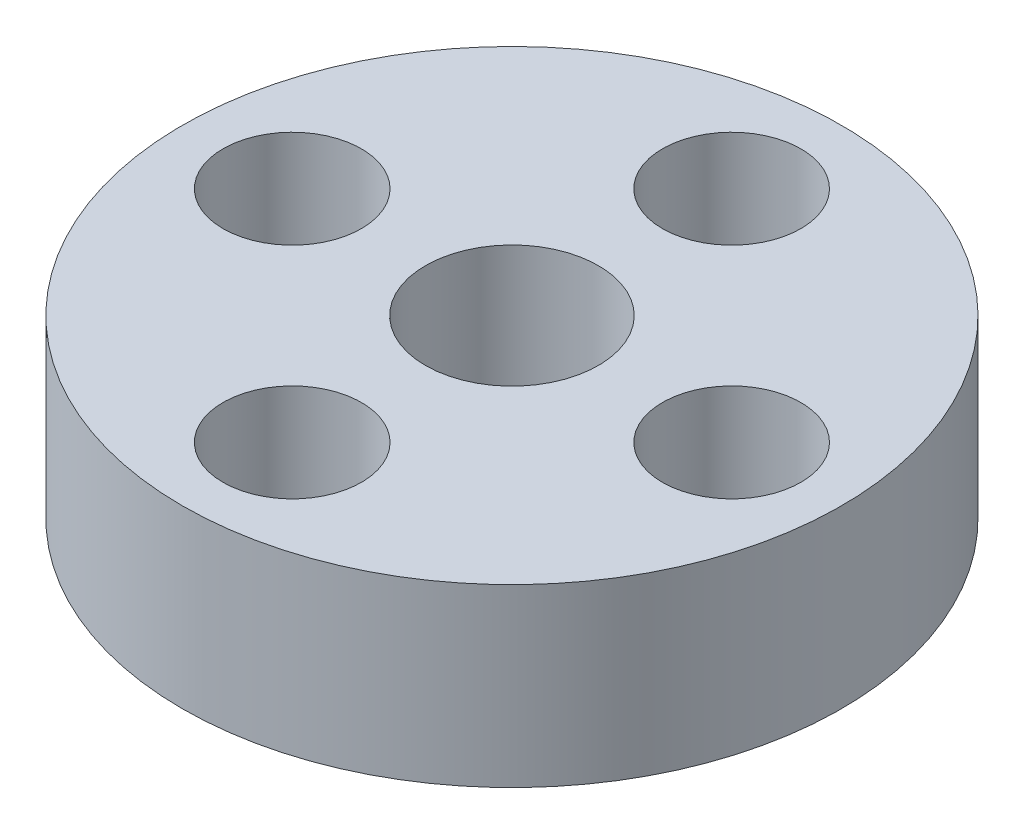
ISO-10303-21;
HEADER;
FILE_DESCRIPTION(('STEP AP214'),'2;1');
FILE_NAME('part.step','',(''),(''),'','','');
FILE_SCHEMA(('AUTOMOTIVE_DESIGN { 1 0 10303 214 1 1 1 1 }'));
ENDSEC;
DATA;
#1=APPLICATION_CONTEXT('core data for automotive mechanical design processes');
#2=APPLICATION_PROTOCOL_DEFINITION('international standard','automotive_design',2000,#1);
#3=PRODUCT_CONTEXT('',#1,'mechanical');
#4=PRODUCT('Part','Part','',(#3));
#5=PRODUCT_RELATED_PRODUCT_CATEGORY('part','',(#4));
#6=PRODUCT_DEFINITION_FORMATION('','',#4);
#7=PRODUCT_DEFINITION_CONTEXT('part definition',#1,'design');
#8=PRODUCT_DEFINITION('design','',#6,#7);
#9=PRODUCT_DEFINITION_SHAPE('','',#8);
#10=(LENGTH_UNIT() NAMED_UNIT(*) SI_UNIT(.MILLI.,.METRE.));
#11=(NAMED_UNIT(*) PLANE_ANGLE_UNIT() SI_UNIT($,.RADIAN.));
#12=(NAMED_UNIT(*) SI_UNIT($,.STERADIAN.) SOLID_ANGLE_UNIT());
#13=UNCERTAINTY_MEASURE_WITH_UNIT(LENGTH_MEASURE(1.E-05),#10,'distance_accuracy_value','');
#14=(GEOMETRIC_REPRESENTATION_CONTEXT(3) GLOBAL_UNCERTAINTY_ASSIGNED_CONTEXT((#13)) GLOBAL_UNIT_ASSIGNED_CONTEXT((#10,
#11,#12)) REPRESENTATION_CONTEXT('',''));
#15=CARTESIAN_POINT('',(0.,0.,0.));
#16=DIRECTION('',(0.,0.,1.));
#17=DIRECTION('',(1.,0.,0.));
#18=AXIS2_PLACEMENT_3D('',#15,#16,#17);
#19=CARTESIAN_POINT('',(0.,5.08,0.));
#20=DIRECTION('',(0.,-1.,0.));
#21=DIRECTION('',(0.,0.,-1.));
#22=AXIS2_PLACEMENT_3D('',#19,#20,#21);
#23=CYLINDRICAL_SURFACE('',#22,9.525);
#24=CARTESIAN_POINT('',(0.,5.08,0.));
#25=DIRECTION('',(0.,1.,0.));
#26=DIRECTION('',(0.,0.,1.));
#27=AXIS2_PLACEMENT_3D('',#24,#25,#26);
#28=CIRCLE('',#27,9.525);
#29=CARTESIAN_POINT('',(0.,5.08,9.525));
#30=VERTEX_POINT('',#29);
#31=EDGE_CURVE('E10',#30,#30,#28,.T.);
#32=ORIENTED_EDGE('',*,*,#31,.F.);
#33=EDGE_LOOP('',(#32));
#34=FACE_BOUND('',#33,.T.);
#35=CARTESIAN_POINT('',(0.,0.,0.));
#36=DIRECTION('',(0.,1.,0.));
#37=DIRECTION('',(0.,0.,1.));
#38=AXIS2_PLACEMENT_3D('',#35,#36,#37);
#39=CIRCLE('',#38,9.525);
#40=CARTESIAN_POINT('',(0.,0.,9.525));
#41=VERTEX_POINT('',#40);
#42=EDGE_CURVE('E34',#41,#41,#39,.T.);
#43=ORIENTED_EDGE('',*,*,#42,.T.);
#44=EDGE_LOOP('',(#43));
#45=FACE_BOUND('',#44,.T.);
#46=ADVANCED_FACE('F31',(#34,#45),#23,.T.);
#47=CARTESIAN_POINT('',(0.,5.08,0.));
#48=DIRECTION('',(0.,1.,0.));
#49=DIRECTION('',(0.,0.,1.));
#50=AXIS2_PLACEMENT_3D('',#47,#48,#49);
#51=PLANE('',#50);
#52=CARTESIAN_POINT('',(-6.35,5.08,0.));
#53=DIRECTION('',(0.,1.,0.));
#54=DIRECTION('',(0.,0.,1.));
#55=AXIS2_PLACEMENT_3D('',#52,#53,#54);
#56=CIRCLE('',#55,2.);
#57=CARTESIAN_POINT('',(-6.35,5.08,2.));
#58=VERTEX_POINT('',#57);
#59=EDGE_CURVE('E56',#58,#58,#56,.T.);
#60=ORIENTED_EDGE('',*,*,#59,.F.);
#61=EDGE_LOOP('',(#60));
#62=FACE_BOUND('',#61,.T.);
#63=CARTESIAN_POINT('',(0.,5.08,6.35));
#64=DIRECTION('',(0.,1.,0.));
#65=DIRECTION('',(0.,0.,1.));
#66=AXIS2_PLACEMENT_3D('',#63,#64,#65);
#67=CIRCLE('',#66,2.);
#68=CARTESIAN_POINT('',(0.,5.08,8.35));
#69=VERTEX_POINT('',#68);
#70=EDGE_CURVE('E57',#69,#69,#67,.T.);
#71=ORIENTED_EDGE('',*,*,#70,.F.);
#72=EDGE_LOOP('',(#71));
#73=FACE_BOUND('',#72,.T.);
#74=CARTESIAN_POINT('',(6.35,5.08,0.));
#75=DIRECTION('',(0.,1.,0.));
#76=DIRECTION('',(0.,0.,1.));
#77=AXIS2_PLACEMENT_3D('',#74,#75,#76);
#78=CIRCLE('',#77,2.);
#79=CARTESIAN_POINT('',(6.35,5.08,2.00000000000004));
#80=VERTEX_POINT('',#79);
#81=EDGE_CURVE('E63',#80,#80,#78,.T.);
#82=ORIENTED_EDGE('',*,*,#81,.F.);
#83=EDGE_LOOP('',(#82));
#84=FACE_BOUND('',#83,.T.);
#85=CARTESIAN_POINT('',(0.,5.08,-6.35));
#86=DIRECTION('',(0.,1.,0.));
#87=DIRECTION('',(0.,0.,1.));
#88=AXIS2_PLACEMENT_3D('',#85,#86,#87);
#89=CIRCLE('',#88,2.);
#90=CARTESIAN_POINT('',(0.,5.08,-4.35));
#91=VERTEX_POINT('',#90);
#92=EDGE_CURVE('E43',#91,#91,#89,.T.);
#93=ORIENTED_EDGE('',*,*,#92,.F.);
#94=EDGE_LOOP('',(#93));
#95=FACE_BOUND('',#94,.T.);
#96=CARTESIAN_POINT('',(0.,5.08,0.));
#97=DIRECTION('',(0.,1.,0.));
#98=DIRECTION('',(0.,0.,1.));
#99=AXIS2_PLACEMENT_3D('',#96,#97,#98);
#100=CIRCLE('',#99,2.5);
#101=CARTESIAN_POINT('',(0.,5.08,2.5));
#102=VERTEX_POINT('',#101);
#103=EDGE_CURVE('E50',#102,#102,#100,.T.);
#104=ORIENTED_EDGE('',*,*,#103,.F.);
#105=EDGE_LOOP('',(#104));
#106=FACE_BOUND('',#105,.T.);
#107=ORIENTED_EDGE('',*,*,#31,.T.);
#108=EDGE_LOOP('',(#107));
#109=FACE_BOUND('',#108,.T.);
#110=ADVANCED_FACE('F83',(#62,#73,#84,#95,#106,#109),#51,.T.);
#111=CARTESIAN_POINT('',(0.,0.,0.));
#112=DIRECTION('',(0.,1.,0.));
#113=DIRECTION('',(0.,0.,1.));
#114=AXIS2_PLACEMENT_3D('',#111,#112,#113);
#115=PLANE('',#114);
#116=CARTESIAN_POINT('',(-6.35,0.,0.));
#117=DIRECTION('',(0.,1.,0.));
#118=DIRECTION('',(0.,0.,1.));
#119=AXIS2_PLACEMENT_3D('',#116,#117,#118);
#120=CIRCLE('',#119,2.);
#121=CARTESIAN_POINT('',(-6.35,0.,2.));
#122=VERTEX_POINT('',#121);
#123=EDGE_CURVE('E41',#122,#122,#120,.T.);
#124=ORIENTED_EDGE('',*,*,#123,.T.);
#125=EDGE_LOOP('',(#124));
#126=FACE_BOUND('',#125,.T.);
#127=CARTESIAN_POINT('',(0.,0.,6.35));
#128=DIRECTION('',(0.,1.,0.));
#129=DIRECTION('',(0.,0.,1.));
#130=AXIS2_PLACEMENT_3D('',#127,#128,#129);
#131=CIRCLE('',#130,2.);
#132=CARTESIAN_POINT('',(0.,0.,8.35));
#133=VERTEX_POINT('',#132);
#134=EDGE_CURVE('E60',#133,#133,#131,.T.);
#135=ORIENTED_EDGE('',*,*,#134,.T.);
#136=EDGE_LOOP('',(#135));
#137=FACE_BOUND('',#136,.T.);
#138=CARTESIAN_POINT('',(6.35,0.,0.));
#139=DIRECTION('',(0.,1.,0.));
#140=DIRECTION('',(0.,0.,1.));
#141=AXIS2_PLACEMENT_3D('',#138,#139,#140);
#142=CIRCLE('',#141,2.);
#143=CARTESIAN_POINT('',(6.35,0.,2.00000000000004));
#144=VERTEX_POINT('',#143);
#145=EDGE_CURVE('E47',#144,#144,#142,.T.);
#146=ORIENTED_EDGE('',*,*,#145,.T.);
#147=EDGE_LOOP('',(#146));
#148=FACE_BOUND('',#147,.T.);
#149=CARTESIAN_POINT('',(0.,0.,-6.35));
#150=DIRECTION('',(0.,1.,0.));
#151=DIRECTION('',(0.,0.,1.));
#152=AXIS2_PLACEMENT_3D('',#149,#150,#151);
#153=CIRCLE('',#152,2.);
#154=CARTESIAN_POINT('',(0.,0.,-4.35));
#155=VERTEX_POINT('',#154);
#156=EDGE_CURVE('E46',#155,#155,#153,.T.);
#157=ORIENTED_EDGE('',*,*,#156,.T.);
#158=EDGE_LOOP('',(#157));
#159=FACE_BOUND('',#158,.T.);
#160=CARTESIAN_POINT('',(0.,0.,0.));
#161=DIRECTION('',(0.,1.,0.));
#162=DIRECTION('',(0.,0.,1.));
#163=AXIS2_PLACEMENT_3D('',#160,#161,#162);
#164=CIRCLE('',#163,2.5);
#165=CARTESIAN_POINT('',(0.,0.,2.5));
#166=VERTEX_POINT('',#165);
#167=EDGE_CURVE('E53',#166,#166,#164,.T.);
#168=ORIENTED_EDGE('',*,*,#167,.T.);
#169=EDGE_LOOP('',(#168));
#170=FACE_BOUND('',#169,.T.);
#171=ORIENTED_EDGE('',*,*,#42,.F.);
#172=EDGE_LOOP('',(#171));
#173=FACE_BOUND('',#172,.T.);
#174=ADVANCED_FACE('F73',(#126,#137,#148,#159,#170,#173),#115,.F.);
#175=CARTESIAN_POINT('',(0.,0.,0.));
#176=DIRECTION('',(0.,1.,0.));
#177=DIRECTION('',(0.,0.,1.));
#178=AXIS2_PLACEMENT_3D('',#175,#176,#177);
#179=CYLINDRICAL_SURFACE('',#178,2.5);
#180=ORIENTED_EDGE('',*,*,#167,.F.);
#181=EDGE_LOOP('',(#180));
#182=FACE_BOUND('',#181,.T.);
#183=ORIENTED_EDGE('',*,*,#103,.T.);
#184=EDGE_LOOP('',(#183));
#185=FACE_BOUND('',#184,.T.);
#186=ADVANCED_FACE('F95',(#182,#185),#179,.F.);
#187=CARTESIAN_POINT('',(0.,0.,-6.35));
#188=DIRECTION('',(0.,1.,0.));
#189=DIRECTION('',(0.,0.,1.));
#190=AXIS2_PLACEMENT_3D('',#187,#188,#189);
#191=CYLINDRICAL_SURFACE('',#190,2.);
#192=ORIENTED_EDGE('',*,*,#156,.F.);
#193=EDGE_LOOP('',(#192));
#194=FACE_BOUND('',#193,.T.);
#195=ORIENTED_EDGE('',*,*,#92,.T.);
#196=EDGE_LOOP('',(#195));
#197=FACE_BOUND('',#196,.T.);
#198=ADVANCED_FACE('F97',(#194,#197),#191,.F.);
#199=CARTESIAN_POINT('',(6.35,0.,0.));
#200=DIRECTION('',(0.,1.,0.));
#201=DIRECTION('',(0.,0.,1.));
#202=AXIS2_PLACEMENT_3D('',#199,#200,#201);
#203=CYLINDRICAL_SURFACE('',#202,2.);
#204=ORIENTED_EDGE('',*,*,#145,.F.);
#205=EDGE_LOOP('',(#204));
#206=FACE_BOUND('',#205,.T.);
#207=ORIENTED_EDGE('',*,*,#81,.T.);
#208=EDGE_LOOP('',(#207));
#209=FACE_BOUND('',#208,.T.);
#210=ADVANCED_FACE('F104',(#206,#209),#203,.F.);
#211=CARTESIAN_POINT('',(0.,0.,6.35));
#212=DIRECTION('',(0.,1.,0.));
#213=DIRECTION('',(0.,0.,1.));
#214=AXIS2_PLACEMENT_3D('',#211,#212,#213);
#215=CYLINDRICAL_SURFACE('',#214,2.);
#216=ORIENTED_EDGE('',*,*,#134,.F.);
#217=EDGE_LOOP('',(#216));
#218=FACE_BOUND('',#217,.T.);
#219=ORIENTED_EDGE('',*,*,#70,.T.);
#220=EDGE_LOOP('',(#219));
#221=FACE_BOUND('',#220,.T.);
#222=ADVANCED_FACE('F79',(#218,#221),#215,.F.);
#223=CARTESIAN_POINT('',(-6.35,0.,0.));
#224=DIRECTION('',(0.,1.,0.));
#225=DIRECTION('',(0.,0.,1.));
#226=AXIS2_PLACEMENT_3D('',#223,#224,#225);
#227=CYLINDRICAL_SURFACE('',#226,2.);
#228=ORIENTED_EDGE('',*,*,#123,.F.);
#229=EDGE_LOOP('',(#228));
#230=FACE_BOUND('',#229,.T.);
#231=ORIENTED_EDGE('',*,*,#59,.T.);
#232=EDGE_LOOP('',(#231));
#233=FACE_BOUND('',#232,.T.);
#234=ADVANCED_FACE('F76',(#230,#233),#227,.F.);
#235=CLOSED_SHELL('',(#46,#110,#174,#186,#198,#210,#222,#234));
#236=MANIFOLD_SOLID_BREP('B2',#235);
#237=ADVANCED_BREP_SHAPE_REPRESENTATION('',(#18,#236),#14);
#238=SHAPE_DEFINITION_REPRESENTATION(#9,#237);
ENDSEC;
END-ISO-10303-21;
